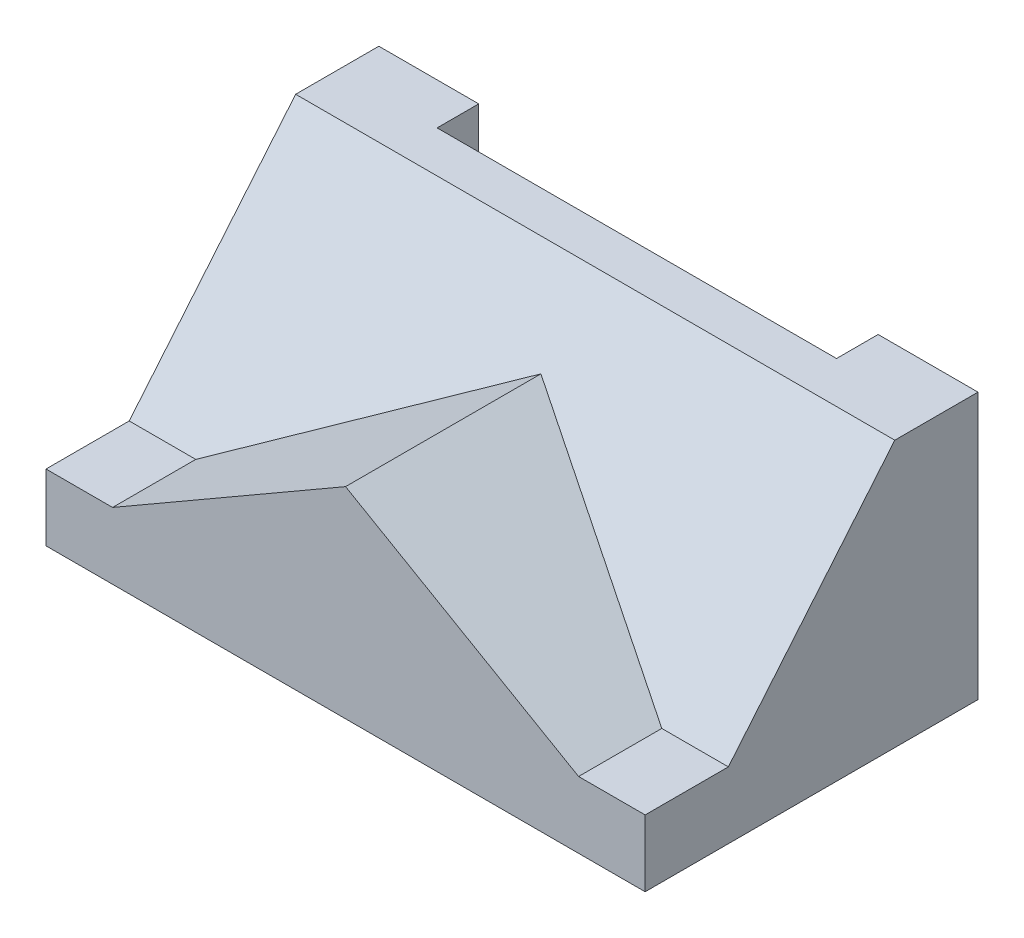
ISO-10303-21;
HEADER;
FILE_DESCRIPTION(('STEP AP214'),'2;1');
FILE_NAME('part.step','',(''),(''),'','','');
FILE_SCHEMA(('AUTOMOTIVE_DESIGN { 1 0 10303 214 1 1 1 1 }'));
ENDSEC;
DATA;
#1=APPLICATION_CONTEXT('core data for automotive mechanical design processes');
#2=APPLICATION_PROTOCOL_DEFINITION('international standard','automotive_design',2000,#1);
#3=PRODUCT_CONTEXT('',#1,'mechanical');
#4=PRODUCT('Part','Part','',(#3));
#5=PRODUCT_RELATED_PRODUCT_CATEGORY('part','',(#4));
#6=PRODUCT_DEFINITION_FORMATION('','',#4);
#7=PRODUCT_DEFINITION_CONTEXT('part definition',#1,'design');
#8=PRODUCT_DEFINITION('design','',#6,#7);
#9=PRODUCT_DEFINITION_SHAPE('','',#8);
#10=(LENGTH_UNIT() NAMED_UNIT(*) SI_UNIT(.MILLI.,.METRE.));
#11=(NAMED_UNIT(*) PLANE_ANGLE_UNIT() SI_UNIT($,.RADIAN.));
#12=(NAMED_UNIT(*) SI_UNIT($,.STERADIAN.) SOLID_ANGLE_UNIT());
#13=UNCERTAINTY_MEASURE_WITH_UNIT(LENGTH_MEASURE(1.E-05),#10,'distance_accuracy_value','');
#14=(GEOMETRIC_REPRESENTATION_CONTEXT(3) GLOBAL_UNCERTAINTY_ASSIGNED_CONTEXT((#13)) GLOBAL_UNIT_ASSIGNED_CONTEXT((#10,
#11,#12)) REPRESENTATION_CONTEXT('',''));
#15=CARTESIAN_POINT('',(0.,0.,0.));
#16=DIRECTION('',(0.,0.,1.));
#17=DIRECTION('',(1.,0.,0.));
#18=AXIS2_PLACEMENT_3D('',#15,#16,#17);
#19=CARTESIAN_POINT('',(36.,0.,-40.));
#20=DIRECTION('',(0.,0.,1.));
#21=DIRECTION('',(1.,0.,0.));
#22=AXIS2_PLACEMENT_3D('',#19,#20,#21);
#23=PLANE('',#22);
#24=DIRECTION('',(-1.,0.,0.));
#25=VECTOR('',#24,1.);
#26=CARTESIAN_POINT('',(36.,32.,-40.));
#27=LINE('',#26,#25);
#28=CARTESIAN_POINT('',(-24.,32.,-40.));
#29=VERTEX_POINT('',#28);
#30=CARTESIAN_POINT('',(-36.,32.,-40.));
#31=VERTEX_POINT('',#30);
#32=EDGE_CURVE('E214',#29,#31,#27,.T.);
#33=ORIENTED_EDGE('',*,*,#32,.F.);
#34=DIRECTION('',(0.,1.,0.));
#35=VECTOR('',#34,1.);
#36=CARTESIAN_POINT('',(-24.,0.,-40.));
#37=LINE('',#36,#35);
#38=CARTESIAN_POINT('',(-24.,0.,-40.));
#39=VERTEX_POINT('',#38);
#40=EDGE_CURVE('E154',#39,#29,#37,.T.);
#41=ORIENTED_EDGE('',*,*,#40,.F.);
#42=DIRECTION('',(-1.,0.,0.));
#43=VECTOR('',#42,1.);
#44=CARTESIAN_POINT('',(36.,0.,-40.));
#45=LINE('',#44,#43);
#46=CARTESIAN_POINT('',(-36.,0.,-40.));
#47=VERTEX_POINT('',#46);
#48=EDGE_CURVE('E145',#39,#47,#45,.T.);
#49=ORIENTED_EDGE('',*,*,#48,.T.);
#50=DIRECTION('',(0.,1.,0.));
#51=VECTOR('',#50,1.);
#52=CARTESIAN_POINT('',(-36.,0.,-40.));
#53=LINE('',#52,#51);
#54=EDGE_CURVE('E194',#47,#31,#53,.T.);
#55=ORIENTED_EDGE('',*,*,#54,.T.);
#56=EDGE_LOOP('',(#33,#41,#49,#55));
#57=FACE_BOUND('',#56,.T.);
#58=ADVANCED_FACE('F30',(#57),#23,.F.);
#59=CARTESIAN_POINT('',(36.,8.,0.));
#60=DIRECTION('',(0.,-1.,0.));
#61=DIRECTION('',(0.,0.,-1.));
#62=AXIS2_PLACEMENT_3D('',#59,#60,#61);
#63=PLANE('',#62);
#64=DIRECTION('',(-1.,0.,0.));
#65=VECTOR('',#64,1.);
#66=CARTESIAN_POINT('',(36.,8.,0.));
#67=LINE('',#66,#65);
#68=CARTESIAN_POINT('',(-28.,8.,0.));
#69=VERTEX_POINT('',#68);
#70=CARTESIAN_POINT('',(-36.,8.,0.));
#71=VERTEX_POINT('',#70);
#72=EDGE_CURVE('E189',#69,#71,#67,.T.);
#73=ORIENTED_EDGE('',*,*,#72,.F.);
#74=DIRECTION('',(0.,0.,1.));
#75=VECTOR('',#74,1.);
#76=CARTESIAN_POINT('',(-28.,7.99999999999999,-500000.));
#77=LINE('',#76,#75);
#78=CARTESIAN_POINT('',(-28.,7.99999999999999,-10.0000000001046));
#79=VERTEX_POINT('',#78);
#80=EDGE_CURVE('E171',#79,#69,#77,.T.);
#81=ORIENTED_EDGE('',*,*,#80,.F.);
#82=DIRECTION('',(-1.,0.,0.));
#83=VECTOR('',#82,1.);
#84=CARTESIAN_POINT('',(36.,8.,-10.));
#85=LINE('',#84,#83);
#86=CARTESIAN_POINT('',(-36.,8.,-10.));
#87=VERTEX_POINT('',#86);
#88=EDGE_CURVE('E207',#79,#87,#85,.T.);
#89=ORIENTED_EDGE('',*,*,#88,.T.);
#90=DIRECTION('',(0.,0.,1.));
#91=VECTOR('',#90,1.);
#92=CARTESIAN_POINT('',(-36.,8.,0.));
#93=LINE('',#92,#91);
#94=EDGE_CURVE('E179',#87,#71,#93,.T.);
#95=ORIENTED_EDGE('',*,*,#94,.T.);
#96=EDGE_LOOP('',(#73,#81,#89,#95));
#97=FACE_BOUND('',#96,.T.);
#98=ADVANCED_FACE('F253',(#97),#63,.F.);
#99=CARTESIAN_POINT('',(36.,8.,0.));
#100=DIRECTION('',(0.,0.,-1.));
#101=DIRECTION('',(0.,1.,0.));
#102=AXIS2_PLACEMENT_3D('',#99,#100,#101);
#103=PLANE('',#102);
#104=DIRECTION('',(0.,-1.,0.));
#105=VECTOR('',#104,1.);
#106=CARTESIAN_POINT('',(-36.,8.,0.));
#107=LINE('',#106,#105);
#108=CARTESIAN_POINT('',(-36.,0.,0.));
#109=VERTEX_POINT('',#108);
#110=EDGE_CURVE('E167',#71,#109,#107,.T.);
#111=ORIENTED_EDGE('',*,*,#110,.T.);
#112=DIRECTION('',(-1.,0.,0.));
#113=VECTOR('',#112,1.);
#114=CARTESIAN_POINT('',(36.,0.,0.));
#115=LINE('',#114,#113);
#116=CARTESIAN_POINT('',(36.,0.,0.));
#117=VERTEX_POINT('',#116);
#118=EDGE_CURVE('E11',#117,#109,#115,.T.);
#119=ORIENTED_EDGE('',*,*,#118,.F.);
#120=DIRECTION('',(0.,-1.,0.));
#121=VECTOR('',#120,1.);
#122=CARTESIAN_POINT('',(36.,8.,0.));
#123=LINE('',#122,#121);
#124=CARTESIAN_POINT('',(36.,8.,0.));
#125=VERTEX_POINT('',#124);
#126=EDGE_CURVE('E175',#125,#117,#123,.T.);
#127=ORIENTED_EDGE('',*,*,#126,.F.);
#128=CARTESIAN_POINT('',(28.,7.99999999999999,0.));
#129=VERTEX_POINT('',#128);
#130=EDGE_CURVE('E204',#125,#129,#67,.T.);
#131=ORIENTED_EDGE('',*,*,#130,.T.);
#132=DIRECTION('',(-0.86602540378444,0.499999999999998,0.));
#133=VECTOR('',#132,1.);
#134=CARTESIAN_POINT('',(0.,24.1658075373094,0.));
#135=LINE('',#134,#133);
#136=CARTESIAN_POINT('',(0.,24.1658075373094,0.));
#137=VERTEX_POINT('',#136);
#138=EDGE_CURVE('E165',#129,#137,#135,.T.);
#139=ORIENTED_EDGE('',*,*,#138,.T.);
#140=DIRECTION('',(-0.86602540378444,-0.499999999999998,0.));
#141=VECTOR('',#140,1.);
#142=CARTESIAN_POINT('',(0.,24.1658075373094,0.));
#143=LINE('',#142,#141);
#144=EDGE_CURVE('E53',#137,#69,#143,.T.);
#145=ORIENTED_EDGE('',*,*,#144,.T.);
#146=ORIENTED_EDGE('',*,*,#72,.T.);
#147=EDGE_LOOP('',(#111,#119,#127,#131,#139,#145,#146));
#148=FACE_BOUND('',#147,.T.);
#149=ADVANCED_FACE('F32',(#148),#103,.F.);
#150=CARTESIAN_POINT('',(36.,0.,0.));
#151=DIRECTION('',(0.,1.,0.));
#152=DIRECTION('',(0.,0.,1.));
#153=AXIS2_PLACEMENT_3D('',#150,#151,#152);
#154=PLANE('',#153);
#155=ORIENTED_EDGE('',*,*,#48,.F.);
#156=DIRECTION('',(0.,0.,1.));
#157=VECTOR('',#156,1.);
#158=CARTESIAN_POINT('',(-24.,0.,-40.));
#159=LINE('',#158,#157);
#160=CARTESIAN_POINT('',(-24.,0.,-35.));
#161=VERTEX_POINT('',#160);
#162=EDGE_CURVE('E127',#39,#161,#159,.T.);
#163=ORIENTED_EDGE('',*,*,#162,.T.);
#164=DIRECTION('',(1.,0.,0.));
#165=VECTOR('',#164,1.);
#166=CARTESIAN_POINT('',(-24.,0.,-35.));
#167=LINE('',#166,#165);
#168=CARTESIAN_POINT('',(24.,0.,-35.));
#169=VERTEX_POINT('',#168);
#170=EDGE_CURVE('E136',#161,#169,#167,.T.);
#171=ORIENTED_EDGE('',*,*,#170,.T.);
#172=DIRECTION('',(0.,0.,-1.));
#173=VECTOR('',#172,1.);
#174=CARTESIAN_POINT('',(24.,0.,-40.));
#175=LINE('',#174,#173);
#176=CARTESIAN_POINT('',(24.,0.,-40.));
#177=VERTEX_POINT('',#176);
#178=EDGE_CURVE('E133',#169,#177,#175,.T.);
#179=ORIENTED_EDGE('',*,*,#178,.T.);
#180=CARTESIAN_POINT('',(36.,0.,-40.));
#181=VERTEX_POINT('',#180);
#182=EDGE_CURVE('E38',#181,#177,#45,.T.);
#183=ORIENTED_EDGE('',*,*,#182,.F.);
#184=DIRECTION('',(0.,0.,-1.));
#185=VECTOR('',#184,1.);
#186=CARTESIAN_POINT('',(36.,0.,0.));
#187=LINE('',#186,#185);
#188=EDGE_CURVE('E178',#117,#181,#187,.T.);
#189=ORIENTED_EDGE('',*,*,#188,.F.);
#190=ORIENTED_EDGE('',*,*,#118,.T.);
#191=DIRECTION('',(0.,0.,-1.));
#192=VECTOR('',#191,1.);
#193=CARTESIAN_POINT('',(-36.,0.,0.));
#194=LINE('',#193,#192);
#195=EDGE_CURVE('E192',#109,#47,#194,.T.);
#196=ORIENTED_EDGE('',*,*,#195,.T.);
#197=EDGE_LOOP('',(#155,#163,#171,#179,#183,#189,#190,#196));
#198=FACE_BOUND('',#197,.T.);
#199=ADVANCED_FACE('F143',(#198),#154,.F.);
#200=ORIENTED_EDGE('',*,*,#182,.T.);
#201=DIRECTION('',(0.,1.,0.));
#202=VECTOR('',#201,1.);
#203=CARTESIAN_POINT('',(24.,0.,-40.));
#204=LINE('',#203,#202);
#205=CARTESIAN_POINT('',(24.,32.,-40.));
#206=VERTEX_POINT('',#205);
#207=EDGE_CURVE('E157',#177,#206,#204,.T.);
#208=ORIENTED_EDGE('',*,*,#207,.T.);
#209=CARTESIAN_POINT('',(36.,32.,-40.));
#210=VERTEX_POINT('',#209);
#211=EDGE_CURVE('E215',#210,#206,#27,.T.);
#212=ORIENTED_EDGE('',*,*,#211,.F.);
#213=DIRECTION('',(0.,1.,0.));
#214=VECTOR('',#213,1.);
#215=CARTESIAN_POINT('',(36.,0.,-40.));
#216=LINE('',#215,#214);
#217=EDGE_CURVE('E181',#181,#210,#216,.T.);
#218=ORIENTED_EDGE('',*,*,#217,.F.);
#219=EDGE_LOOP('',(#200,#208,#212,#218));
#220=FACE_BOUND('',#219,.T.);
#221=ADVANCED_FACE('F247',(#220),#23,.F.);
#222=CARTESIAN_POINT('',(36.,32.,-40.));
#223=DIRECTION('',(0.,-1.,0.));
#224=DIRECTION('',(0.,0.,-1.));
#225=AXIS2_PLACEMENT_3D('',#222,#223,#224);
#226=PLANE('',#225);
#227=DIRECTION('',(1.,0.,0.));
#228=VECTOR('',#227,1.);
#229=CARTESIAN_POINT('',(-24.,32.,-35.));
#230=LINE('',#229,#228);
#231=CARTESIAN_POINT('',(-24.,32.,-35.));
#232=VERTEX_POINT('',#231);
#233=CARTESIAN_POINT('',(24.,32.,-35.));
#234=VERTEX_POINT('',#233);
#235=EDGE_CURVE('E148',#232,#234,#230,.T.);
#236=ORIENTED_EDGE('',*,*,#235,.F.);
#237=DIRECTION('',(0.,0.,1.));
#238=VECTOR('',#237,1.);
#239=CARTESIAN_POINT('',(-24.,32.,-40.));
#240=LINE('',#239,#238);
#241=EDGE_CURVE('E45',#29,#232,#240,.T.);
#242=ORIENTED_EDGE('',*,*,#241,.F.);
#243=ORIENTED_EDGE('',*,*,#32,.T.);
#244=DIRECTION('',(0.,0.,1.));
#245=VECTOR('',#244,1.);
#246=CARTESIAN_POINT('',(-36.,32.,-40.));
#247=LINE('',#246,#245);
#248=CARTESIAN_POINT('',(-36.,32.,-30.));
#249=VERTEX_POINT('',#248);
#250=EDGE_CURVE('E197',#31,#249,#247,.T.);
#251=ORIENTED_EDGE('',*,*,#250,.T.);
#252=DIRECTION('',(-1.,0.,0.));
#253=VECTOR('',#252,1.);
#254=CARTESIAN_POINT('',(36.,32.,-30.));
#255=LINE('',#254,#253);
#256=CARTESIAN_POINT('',(36.,32.,-30.));
#257=VERTEX_POINT('',#256);
#258=EDGE_CURVE('E211',#257,#249,#255,.T.);
#259=ORIENTED_EDGE('',*,*,#258,.F.);
#260=DIRECTION('',(0.,0.,1.));
#261=VECTOR('',#260,1.);
#262=CARTESIAN_POINT('',(36.,32.,-40.));
#263=LINE('',#262,#261);
#264=EDGE_CURVE('E183',#210,#257,#263,.T.);
#265=ORIENTED_EDGE('',*,*,#264,.F.);
#266=ORIENTED_EDGE('',*,*,#211,.T.);
#267=DIRECTION('',(0.,0.,-1.));
#268=VECTOR('',#267,1.);
#269=CARTESIAN_POINT('',(24.,32.,-40.));
#270=LINE('',#269,#268);
#271=EDGE_CURVE('E146',#234,#206,#270,.T.);
#272=ORIENTED_EDGE('',*,*,#271,.F.);
#273=EDGE_LOOP('',(#236,#242,#243,#251,#259,#265,#266,#272));
#274=FACE_BOUND('',#273,.T.);
#275=ADVANCED_FACE('F233',(#274),#226,.F.);
#276=CARTESIAN_POINT('',(36.,8.,-10.));
#277=DIRECTION('',(0.,-0.64018439966448,-0.768221279597376));
#278=DIRECTION('',(0.,0.768221279597376,-0.64018439966448));
#279=AXIS2_PLACEMENT_3D('',#276,#277,#278);
#280=PLANE('',#279);
#281=ORIENTED_EDGE('',*,*,#88,.F.);
#282=DIRECTION('',(-0.799408065031791,-0.46153846153846,0.384615384615383));
#283=VECTOR('',#282,1.);
#284=CARTESIAN_POINT('',(153725.103540183,88777.3957176643,-73984.496431387));
#285=LINE('',#284,#283);
#286=CARTESIAN_POINT('',(1.42110259751343E-11,24.1658075373123,-23.471506281119));
#287=VERTEX_POINT('',#286);
#288=EDGE_CURVE('E162',#287,#79,#285,.T.);
#289=ORIENTED_EDGE('',*,*,#288,.F.);
#290=DIRECTION('',(-0.799408065031791,0.46153846153846,-0.384615384615383));
#291=VECTOR('',#290,1.);
#292=CARTESIAN_POINT('',(-153725.103540183,88777.3957176643,-73984.496431387));
#293=LINE('',#292,#291);
#294=CARTESIAN_POINT('',(28.,7.99999999999999,-10.0000000001046));
#295=VERTEX_POINT('',#294);
#296=EDGE_CURVE('E156',#295,#287,#293,.T.);
#297=ORIENTED_EDGE('',*,*,#296,.F.);
#298=CARTESIAN_POINT('',(36.,8.,-10.));
#299=VERTEX_POINT('',#298);
#300=EDGE_CURVE('E208',#299,#295,#85,.T.);
#301=ORIENTED_EDGE('',*,*,#300,.F.);
#302=DIRECTION('',(0.,-0.768221279597376,0.64018439966448));
#303=VECTOR('',#302,1.);
#304=CARTESIAN_POINT('',(36.,8.,-10.));
#305=LINE('',#304,#303);
#306=EDGE_CURVE('E185',#257,#299,#305,.T.);
#307=ORIENTED_EDGE('',*,*,#306,.F.);
#308=ORIENTED_EDGE('',*,*,#258,.T.);
#309=DIRECTION('',(0.,-0.768221279597376,0.64018439966448));
#310=VECTOR('',#309,1.);
#311=CARTESIAN_POINT('',(-36.,8.,-10.));
#312=LINE('',#311,#310);
#313=EDGE_CURVE('E199',#249,#87,#312,.T.);
#314=ORIENTED_EDGE('',*,*,#313,.T.);
#315=EDGE_LOOP('',(#281,#289,#297,#301,#307,#308,#314));
#316=FACE_BOUND('',#315,.T.);
#317=ADVANCED_FACE('F238',(#316),#280,.F.);
#318=ORIENTED_EDGE('',*,*,#300,.T.);
#319=DIRECTION('',(0.,0.,1.));
#320=VECTOR('',#319,1.);
#321=CARTESIAN_POINT('',(28.,7.99999999999999,-500000.));
#322=LINE('',#321,#320);
#323=EDGE_CURVE('E169',#295,#129,#322,.T.);
#324=ORIENTED_EDGE('',*,*,#323,.T.);
#325=ORIENTED_EDGE('',*,*,#130,.F.);
#326=DIRECTION('',(0.,0.,1.));
#327=VECTOR('',#326,1.);
#328=CARTESIAN_POINT('',(36.,8.,0.));
#329=LINE('',#328,#327);
#330=EDGE_CURVE('E187',#299,#125,#329,.T.);
#331=ORIENTED_EDGE('',*,*,#330,.F.);
#332=EDGE_LOOP('',(#318,#324,#325,#331));
#333=FACE_BOUND('',#332,.T.);
#334=ADVANCED_FACE('F262',(#333),#63,.F.);
#335=CARTESIAN_POINT('',(36.,0.,0.));
#336=DIRECTION('',(1.,0.,0.));
#337=DIRECTION('',(0.,0.,-1.));
#338=AXIS2_PLACEMENT_3D('',#335,#336,#337);
#339=PLANE('',#338);
#340=ORIENTED_EDGE('',*,*,#126,.T.);
#341=ORIENTED_EDGE('',*,*,#188,.T.);
#342=ORIENTED_EDGE('',*,*,#217,.T.);
#343=ORIENTED_EDGE('',*,*,#264,.T.);
#344=ORIENTED_EDGE('',*,*,#306,.T.);
#345=ORIENTED_EDGE('',*,*,#330,.T.);
#346=EDGE_LOOP('',(#340,#341,#342,#343,#344,#345));
#347=FACE_BOUND('',#346,.T.);
#348=ADVANCED_FACE('F243',(#347),#339,.T.);
#349=CARTESIAN_POINT('',(-36.,0.,0.));
#350=DIRECTION('',(1.,0.,0.));
#351=DIRECTION('',(0.,0.,-1.));
#352=AXIS2_PLACEMENT_3D('',#349,#350,#351);
#353=PLANE('',#352);
#354=ORIENTED_EDGE('',*,*,#110,.F.);
#355=ORIENTED_EDGE('',*,*,#94,.F.);
#356=ORIENTED_EDGE('',*,*,#313,.F.);
#357=ORIENTED_EDGE('',*,*,#250,.F.);
#358=ORIENTED_EDGE('',*,*,#54,.F.);
#359=ORIENTED_EDGE('',*,*,#195,.F.);
#360=EDGE_LOOP('',(#354,#355,#356,#357,#358,#359));
#361=FACE_BOUND('',#360,.T.);
#362=ADVANCED_FACE('F228',(#361),#353,.F.);
#363=CARTESIAN_POINT('',(0.,24.1658075373094,-500000.));
#364=DIRECTION('',(-0.499999999999998,0.86602540378444,0.));
#365=DIRECTION('',(-0.86602540378444,-0.499999999999998,0.));
#366=AXIS2_PLACEMENT_3D('',#363,#364,#365);
#367=PLANE('',#366);
#368=DIRECTION('',(0.,0.,1.));
#369=VECTOR('',#368,1.);
#370=CARTESIAN_POINT('',(0.,24.1658075373094,-500000.));
#371=LINE('',#370,#369);
#372=EDGE_CURVE('E164',#287,#137,#371,.T.);
#373=ORIENTED_EDGE('',*,*,#372,.F.);
#374=ORIENTED_EDGE('',*,*,#288,.T.);
#375=ORIENTED_EDGE('',*,*,#80,.T.);
#376=ORIENTED_EDGE('',*,*,#144,.F.);
#377=EDGE_LOOP('',(#373,#374,#375,#376));
#378=FACE_BOUND('',#377,.T.);
#379=ADVANCED_FACE('F258',(#378),#367,.T.);
#380=CARTESIAN_POINT('',(0.,24.1658075373094,-500000.));
#381=DIRECTION('',(0.499999999999998,0.86602540378444,0.));
#382=DIRECTION('',(-0.86602540378444,0.499999999999998,0.));
#383=AXIS2_PLACEMENT_3D('',#380,#381,#382);
#384=PLANE('',#383);
#385=ORIENTED_EDGE('',*,*,#323,.F.);
#386=ORIENTED_EDGE('',*,*,#296,.T.);
#387=ORIENTED_EDGE('',*,*,#372,.T.);
#388=ORIENTED_EDGE('',*,*,#138,.F.);
#389=EDGE_LOOP('',(#385,#386,#387,#388));
#390=FACE_BOUND('',#389,.T.);
#391=ADVANCED_FACE('F260',(#390),#384,.T.);
#392=CARTESIAN_POINT('',(-24.,0.,-40.));
#393=DIRECTION('',(-1.,0.,0.));
#394=DIRECTION('',(0.,0.,1.));
#395=AXIS2_PLACEMENT_3D('',#392,#393,#394);
#396=PLANE('',#395);
#397=ORIENTED_EDGE('',*,*,#241,.T.);
#398=DIRECTION('',(0.,1.,0.));
#399=VECTOR('',#398,1.);
#400=CARTESIAN_POINT('',(-24.,0.,-35.));
#401=LINE('',#400,#399);
#402=EDGE_CURVE('E123',#161,#232,#401,.T.);
#403=ORIENTED_EDGE('',*,*,#402,.F.);
#404=ORIENTED_EDGE('',*,*,#162,.F.);
#405=ORIENTED_EDGE('',*,*,#40,.T.);
#406=EDGE_LOOP('',(#397,#403,#404,#405));
#407=FACE_BOUND('',#406,.T.);
#408=ADVANCED_FACE('F125',(#407),#396,.F.);
#409=CARTESIAN_POINT('',(24.,0.,-40.));
#410=DIRECTION('',(1.,0.,0.));
#411=DIRECTION('',(0.,0.,-1.));
#412=AXIS2_PLACEMENT_3D('',#409,#410,#411);
#413=PLANE('',#412);
#414=ORIENTED_EDGE('',*,*,#271,.T.);
#415=ORIENTED_EDGE('',*,*,#207,.F.);
#416=ORIENTED_EDGE('',*,*,#178,.F.);
#417=DIRECTION('',(0.,1.,0.));
#418=VECTOR('',#417,1.);
#419=CARTESIAN_POINT('',(24.,0.,-35.));
#420=LINE('',#419,#418);
#421=EDGE_CURVE('E132',#169,#234,#420,.T.);
#422=ORIENTED_EDGE('',*,*,#421,.T.);
#423=EDGE_LOOP('',(#414,#415,#416,#422));
#424=FACE_BOUND('',#423,.T.);
#425=ADVANCED_FACE('F249',(#424),#413,.F.);
#426=CARTESIAN_POINT('',(-24.,0.,-35.));
#427=DIRECTION('',(0.,0.,1.));
#428=DIRECTION('',(0.,-1.,0.));
#429=AXIS2_PLACEMENT_3D('',#426,#427,#428);
#430=PLANE('',#429);
#431=ORIENTED_EDGE('',*,*,#235,.T.);
#432=ORIENTED_EDGE('',*,*,#421,.F.);
#433=ORIENTED_EDGE('',*,*,#170,.F.);
#434=ORIENTED_EDGE('',*,*,#402,.T.);
#435=EDGE_LOOP('',(#431,#432,#433,#434));
#436=FACE_BOUND('',#435,.T.);
#437=ADVANCED_FACE('F137',(#436),#430,.F.);
#438=CLOSED_SHELL('',(#58,#98,#149,#199,#221,#275,#317,#334,#348,#362,#379,#391,#408,#425,#437));
#439=MANIFOLD_SOLID_BREP('B2',#438);
#440=ADVANCED_BREP_SHAPE_REPRESENTATION('',(#18,#439),#14);
#441=SHAPE_DEFINITION_REPRESENTATION(#9,#440);
ENDSEC;
END-ISO-10303-21;
